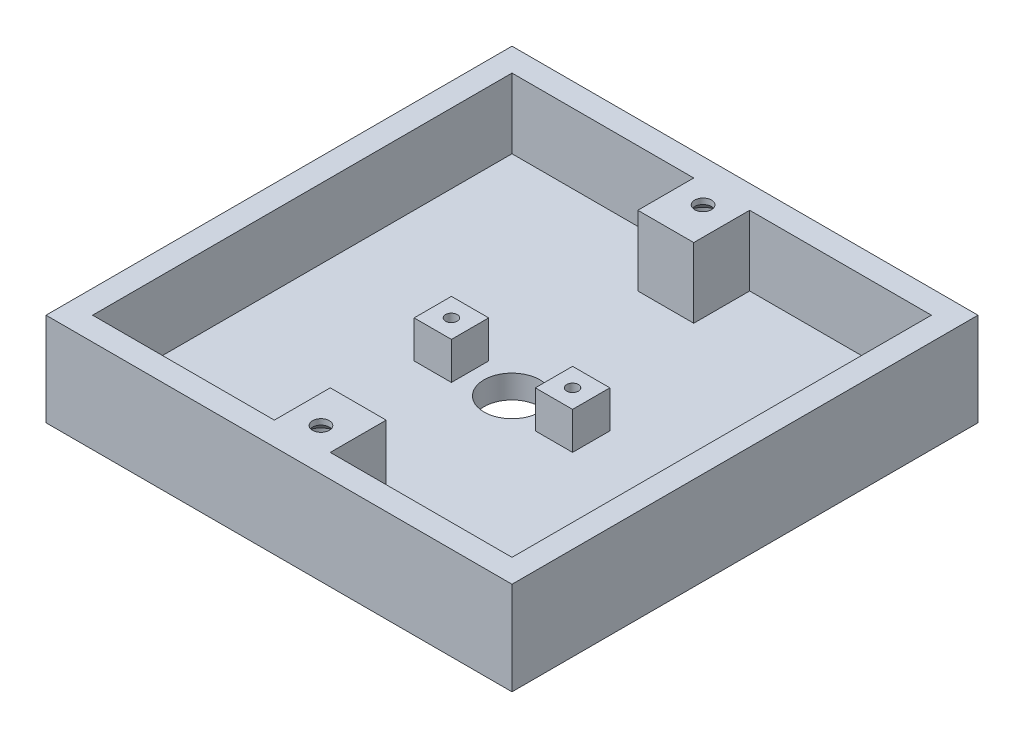
ISO-10303-21;
HEADER;
FILE_DESCRIPTION(('STEP AP214'),'2;1');
FILE_NAME('part.step','',(''),(''),'','','');
FILE_SCHEMA(('AUTOMOTIVE_DESIGN { 1 0 10303 214 1 1 1 1 }'));
ENDSEC;
DATA;
#1=APPLICATION_CONTEXT('core data for automotive mechanical design processes');
#2=APPLICATION_PROTOCOL_DEFINITION('international standard','automotive_design',2000,#1);
#3=PRODUCT_CONTEXT('',#1,'mechanical');
#4=PRODUCT('Part','Part','',(#3));
#5=PRODUCT_RELATED_PRODUCT_CATEGORY('part','',(#4));
#6=PRODUCT_DEFINITION_FORMATION('','',#4);
#7=PRODUCT_DEFINITION_CONTEXT('part definition',#1,'design');
#8=PRODUCT_DEFINITION('design','',#6,#7);
#9=PRODUCT_DEFINITION_SHAPE('','',#8);
#10=(LENGTH_UNIT() NAMED_UNIT(*) SI_UNIT(.MILLI.,.METRE.));
#11=(NAMED_UNIT(*) PLANE_ANGLE_UNIT() SI_UNIT($,.RADIAN.));
#12=(NAMED_UNIT(*) SI_UNIT($,.STERADIAN.) SOLID_ANGLE_UNIT());
#13=UNCERTAINTY_MEASURE_WITH_UNIT(LENGTH_MEASURE(1.E-05),#10,'distance_accuracy_value','');
#14=(GEOMETRIC_REPRESENTATION_CONTEXT(3) GLOBAL_UNCERTAINTY_ASSIGNED_CONTEXT((#13)) GLOBAL_UNIT_ASSIGNED_CONTEXT((#10,
#11,#12)) REPRESENTATION_CONTEXT('',''));
#15=CARTESIAN_POINT('',(0.,0.,0.));
#16=DIRECTION('',(0.,0.,1.));
#17=DIRECTION('',(1.,0.,0.));
#18=AXIS2_PLACEMENT_3D('',#15,#16,#17);
#19=CARTESIAN_POINT('',(0.,2.5,0.));
#20=DIRECTION('',(0.,-1.,0.));
#21=DIRECTION('',(0.,0.,-1.));
#22=AXIS2_PLACEMENT_3D('',#19,#20,#21);
#23=PLANE('',#22);
#24=DIRECTION('',(0.,0.,1.));
#25=VECTOR('',#24,1.);
#26=CARTESIAN_POINT('',(-8.50000000000001,2.5,2.));
#27=LINE('',#26,#25);
#28=CARTESIAN_POINT('',(-8.50000000000001,2.5,-2.));
#29=VERTEX_POINT('',#28);
#30=CARTESIAN_POINT('',(-8.50000000000001,2.5,2.));
#31=VERTEX_POINT('',#30);
#32=EDGE_CURVE('E206',#29,#31,#27,.T.);
#33=ORIENTED_EDGE('',*,*,#32,.F.);
#34=DIRECTION('',(-1.,0.,0.));
#35=VECTOR('',#34,1.);
#36=CARTESIAN_POINT('',(-4.50000000000001,2.5,-2.));
#37=LINE('',#36,#35);
#38=CARTESIAN_POINT('',(-4.50000000000001,2.5,-2.));
#39=VERTEX_POINT('',#38);
#40=EDGE_CURVE('E239',#39,#29,#37,.T.);
#41=ORIENTED_EDGE('',*,*,#40,.F.);
#42=DIRECTION('',(0.,0.,-1.));
#43=VECTOR('',#42,1.);
#44=CARTESIAN_POINT('',(-4.50000000000001,2.5,2.));
#45=LINE('',#44,#43);
#46=CARTESIAN_POINT('',(-4.50000000000001,2.5,2.));
#47=VERTEX_POINT('',#46);
#48=EDGE_CURVE('E251',#47,#39,#45,.T.);
#49=ORIENTED_EDGE('',*,*,#48,.F.);
#50=DIRECTION('',(1.,0.,0.));
#51=VECTOR('',#50,1.);
#52=CARTESIAN_POINT('',(-4.50000000000001,2.5,2.));
#53=LINE('',#52,#51);
#54=EDGE_CURVE('E248',#31,#47,#53,.T.);
#55=ORIENTED_EDGE('',*,*,#54,.F.);
#56=EDGE_LOOP('',(#33,#41,#49,#55));
#57=FACE_BOUND('',#56,.T.);
#58=CARTESIAN_POINT('',(0.,2.5,0.));
#59=DIRECTION('',(0.,-1.,0.));
#60=DIRECTION('',(0.,0.,-1.));
#61=AXIS2_PLACEMENT_3D('',#58,#59,#60);
#62=CIRCLE('',#61,3.);
#63=CARTESIAN_POINT('',(0.,2.5,-3.));
#64=VERTEX_POINT('',#63);
#65=EDGE_CURVE('E270',#64,#64,#62,.T.);
#66=ORIENTED_EDGE('',*,*,#65,.T.);
#67=EDGE_LOOP('',(#66));
#68=FACE_BOUND('',#67,.T.);
#69=DIRECTION('',(-1.,0.,0.));
#70=VECTOR('',#69,1.);
#71=CARTESIAN_POINT('',(0.,2.5,-22.5));
#72=LINE('',#71,#70);
#73=CARTESIAN_POINT('',(22.5,2.5,-22.5));
#74=VERTEX_POINT('',#73);
#75=CARTESIAN_POINT('',(3.00000000000001,2.5,-22.5));
#76=VERTEX_POINT('',#75);
#77=EDGE_CURVE('E374',#74,#76,#72,.T.);
#78=ORIENTED_EDGE('',*,*,#77,.T.);
#79=DIRECTION('',(0.,0.,1.));
#80=VECTOR('',#79,1.);
#81=CARTESIAN_POINT('',(3.00000000000001,2.5,-16.5));
#82=LINE('',#81,#80);
#83=CARTESIAN_POINT('',(3.00000000000001,2.5,-16.5));
#84=VERTEX_POINT('',#83);
#85=EDGE_CURVE('E285',#76,#84,#82,.T.);
#86=ORIENTED_EDGE('',*,*,#85,.T.);
#87=DIRECTION('',(-1.,0.,0.));
#88=VECTOR('',#87,1.);
#89=CARTESIAN_POINT('',(-3.,2.5,-16.5));
#90=LINE('',#89,#88);
#91=CARTESIAN_POINT('',(-3.,2.5,-16.5));
#92=VERTEX_POINT('',#91);
#93=EDGE_CURVE('E296',#84,#92,#90,.T.);
#94=ORIENTED_EDGE('',*,*,#93,.T.);
#95=DIRECTION('',(0.,0.,-1.));
#96=VECTOR('',#95,1.);
#97=CARTESIAN_POINT('',(-3.,2.5,-16.5));
#98=LINE('',#97,#96);
#99=CARTESIAN_POINT('',(-3.,2.5,-22.5));
#100=VERTEX_POINT('',#99);
#101=EDGE_CURVE('E294',#92,#100,#98,.T.);
#102=ORIENTED_EDGE('',*,*,#101,.T.);
#103=CARTESIAN_POINT('',(-22.5,2.5,-22.5));
#104=VERTEX_POINT('',#103);
#105=EDGE_CURVE('E371',#100,#104,#72,.T.);
#106=ORIENTED_EDGE('',*,*,#105,.T.);
#107=DIRECTION('',(0.,0.,1.));
#108=VECTOR('',#107,1.);
#109=CARTESIAN_POINT('',(-22.5,2.5,0.));
#110=LINE('',#109,#108);
#111=CARTESIAN_POINT('',(-22.5,2.5,22.5));
#112=VERTEX_POINT('',#111);
#113=EDGE_CURVE('E332',#104,#112,#110,.T.);
#114=ORIENTED_EDGE('',*,*,#113,.T.);
#115=DIRECTION('',(1.,0.,0.));
#116=VECTOR('',#115,1.);
#117=CARTESIAN_POINT('',(0.,2.5,22.5));
#118=LINE('',#117,#116);
#119=CARTESIAN_POINT('',(-3.,2.5,22.5));
#120=VERTEX_POINT('',#119);
#121=EDGE_CURVE('E364',#112,#120,#118,.T.);
#122=ORIENTED_EDGE('',*,*,#121,.T.);
#123=DIRECTION('',(0.,0.,1.));
#124=VECTOR('',#123,1.);
#125=CARTESIAN_POINT('',(-3.,2.5,16.5));
#126=LINE('',#125,#124);
#127=CARTESIAN_POINT('',(-3.,2.5,16.5));
#128=VERTEX_POINT('',#127);
#129=EDGE_CURVE('E338',#128,#120,#126,.T.);
#130=ORIENTED_EDGE('',*,*,#129,.F.);
#131=DIRECTION('',(-1.,0.,0.));
#132=VECTOR('',#131,1.);
#133=CARTESIAN_POINT('',(-3.,2.5,16.5));
#134=LINE('',#133,#132);
#135=CARTESIAN_POINT('',(3.00000000000001,2.5,16.5));
#136=VERTEX_POINT('',#135);
#137=EDGE_CURVE('E335',#136,#128,#134,.T.);
#138=ORIENTED_EDGE('',*,*,#137,.F.);
#139=DIRECTION('',(0.,0.,-1.));
#140=VECTOR('',#139,1.);
#141=CARTESIAN_POINT('',(3.00000000000001,2.5,16.5));
#142=LINE('',#141,#140);
#143=CARTESIAN_POINT('',(3.00000000000001,2.5,22.5));
#144=VERTEX_POINT('',#143);
#145=EDGE_CURVE('E321',#144,#136,#142,.T.);
#146=ORIENTED_EDGE('',*,*,#145,.F.);
#147=CARTESIAN_POINT('',(22.5,2.5,22.5));
#148=VERTEX_POINT('',#147);
#149=EDGE_CURVE('E353',#144,#148,#118,.T.);
#150=ORIENTED_EDGE('',*,*,#149,.T.);
#151=DIRECTION('',(0.,0.,-1.));
#152=VECTOR('',#151,1.);
#153=CARTESIAN_POINT('',(22.5,2.5,0.));
#154=LINE('',#153,#152);
#155=EDGE_CURVE('E367',#148,#74,#154,.T.);
#156=ORIENTED_EDGE('',*,*,#155,.T.);
#157=EDGE_LOOP('',(#78,#86,#94,#102,#106,#114,#122,#130,#138,#146,#150,#156));
#158=FACE_BOUND('',#157,.T.);
#159=DIRECTION('',(0.,0.,-1.));
#160=VECTOR('',#159,1.);
#161=CARTESIAN_POINT('',(8.5,2.5,2.));
#162=LINE('',#161,#160);
#163=CARTESIAN_POINT('',(8.5,2.5,2.));
#164=VERTEX_POINT('',#163);
#165=CARTESIAN_POINT('',(8.5,2.5,-2.));
#166=VERTEX_POINT('',#165);
#167=EDGE_CURVE('E200',#164,#166,#162,.T.);
#168=ORIENTED_EDGE('',*,*,#167,.F.);
#169=DIRECTION('',(1.,0.,0.));
#170=VECTOR('',#169,1.);
#171=CARTESIAN_POINT('',(4.5,2.5,2.));
#172=LINE('',#171,#170);
#173=CARTESIAN_POINT('',(4.5,2.5,2.));
#174=VERTEX_POINT('',#173);
#175=EDGE_CURVE('E202',#174,#164,#172,.T.);
#176=ORIENTED_EDGE('',*,*,#175,.F.);
#177=DIRECTION('',(0.,0.,1.));
#178=VECTOR('',#177,1.);
#179=CARTESIAN_POINT('',(4.5,2.5,2.));
#180=LINE('',#179,#178);
#181=CARTESIAN_POINT('',(4.5,2.5,-2.));
#182=VERTEX_POINT('',#181);
#183=EDGE_CURVE('E63',#182,#174,#180,.T.);
#184=ORIENTED_EDGE('',*,*,#183,.F.);
#185=DIRECTION('',(-1.,0.,0.));
#186=VECTOR('',#185,1.);
#187=CARTESIAN_POINT('',(4.5,2.5,-2.));
#188=LINE('',#187,#186);
#189=EDGE_CURVE('E58',#166,#182,#188,.T.);
#190=ORIENTED_EDGE('',*,*,#189,.F.);
#191=EDGE_LOOP('',(#168,#176,#184,#190));
#192=FACE_BOUND('',#191,.T.);
#193=ADVANCED_FACE('F43',(#57,#68,#158,#192),#23,.F.);
#194=CARTESIAN_POINT('',(25.,10.,-22.5));
#195=DIRECTION('',(0.,0.,1.));
#196=DIRECTION('',(1.,0.,0.));
#197=AXIS2_PLACEMENT_3D('',#194,#195,#196);
#198=PLANE('',#197);
#199=DIRECTION('',(0.,-1.,0.));
#200=VECTOR('',#199,1.);
#201=CARTESIAN_POINT('',(3.00000000000001,18.4852813742386,-22.5));
#202=LINE('',#201,#200);
#203=CARTESIAN_POINT('',(3.00000000000001,10.,-22.5));
#204=VERTEX_POINT('',#203);
#205=EDGE_CURVE('E289',#204,#76,#202,.T.);
#206=ORIENTED_EDGE('',*,*,#205,.T.);
#207=ORIENTED_EDGE('',*,*,#77,.F.);
#208=DIRECTION('',(0.,-1.,0.));
#209=VECTOR('',#208,1.);
#210=CARTESIAN_POINT('',(22.5,10.,-22.5));
#211=LINE('',#210,#209);
#212=CARTESIAN_POINT('',(22.5,10.,-22.5));
#213=VERTEX_POINT('',#212);
#214=EDGE_CURVE('E362',#213,#74,#211,.T.);
#215=ORIENTED_EDGE('',*,*,#214,.F.);
#216=DIRECTION('',(-1.,0.,0.));
#217=VECTOR('',#216,1.);
#218=CARTESIAN_POINT('',(0.,10.,-22.5));
#219=LINE('',#218,#217);
#220=EDGE_CURVE('E363',#213,#204,#219,.T.);
#221=ORIENTED_EDGE('',*,*,#220,.T.);
#222=EDGE_LOOP('',(#206,#207,#215,#221));
#223=FACE_BOUND('',#222,.T.);
#224=ADVANCED_FACE('F439',(#223),#198,.T.);
#225=CARTESIAN_POINT('',(25.,10.,22.5));
#226=DIRECTION('',(0.,0.,-1.));
#227=DIRECTION('',(-1.,0.,0.));
#228=AXIS2_PLACEMENT_3D('',#225,#226,#227);
#229=PLANE('',#228);
#230=DIRECTION('',(1.,0.,0.));
#231=VECTOR('',#230,1.);
#232=CARTESIAN_POINT('',(0.,10.,22.5));
#233=LINE('',#232,#231);
#234=CARTESIAN_POINT('',(-22.5,10.,22.5));
#235=VERTEX_POINT('',#234);
#236=CARTESIAN_POINT('',(-3.,10.,22.5));
#237=VERTEX_POINT('',#236);
#238=EDGE_CURVE('E380',#235,#237,#233,.T.);
#239=ORIENTED_EDGE('',*,*,#238,.T.);
#240=DIRECTION('',(0.,-1.,0.));
#241=VECTOR('',#240,1.);
#242=CARTESIAN_POINT('',(-3.,18.4852813742386,22.5));
#243=LINE('',#242,#241);
#244=EDGE_CURVE('E344',#237,#120,#243,.T.);
#245=ORIENTED_EDGE('',*,*,#244,.T.);
#246=ORIENTED_EDGE('',*,*,#121,.F.);
#247=DIRECTION('',(0.,-1.,0.));
#248=VECTOR('',#247,1.);
#249=CARTESIAN_POINT('',(-22.5,10.,22.5));
#250=LINE('',#249,#248);
#251=EDGE_CURVE('E354',#235,#112,#250,.T.);
#252=ORIENTED_EDGE('',*,*,#251,.F.);
#253=EDGE_LOOP('',(#239,#245,#246,#252));
#254=FACE_BOUND('',#253,.T.);
#255=ADVANCED_FACE('F447',(#254),#229,.T.);
#256=ORIENTED_EDGE('',*,*,#149,.F.);
#257=DIRECTION('',(0.,-1.,0.));
#258=VECTOR('',#257,1.);
#259=CARTESIAN_POINT('',(3.00000000000001,18.4852813742386,22.5));
#260=LINE('',#259,#258);
#261=CARTESIAN_POINT('',(3.00000000000001,10.,22.5));
#262=VERTEX_POINT('',#261);
#263=EDGE_CURVE('E341',#262,#144,#260,.T.);
#264=ORIENTED_EDGE('',*,*,#263,.F.);
#265=CARTESIAN_POINT('',(22.5,10.,22.5));
#266=VERTEX_POINT('',#265);
#267=EDGE_CURVE('E379',#262,#266,#233,.T.);
#268=ORIENTED_EDGE('',*,*,#267,.T.);
#269=DIRECTION('',(0.,-1.,0.));
#270=VECTOR('',#269,1.);
#271=CARTESIAN_POINT('',(22.5,10.,22.5));
#272=LINE('',#271,#270);
#273=EDGE_CURVE('E358',#266,#148,#272,.T.);
#274=ORIENTED_EDGE('',*,*,#273,.T.);
#275=EDGE_LOOP('',(#256,#264,#268,#274));
#276=FACE_BOUND('',#275,.T.);
#277=ADVANCED_FACE('F456',(#276),#229,.T.);
#278=CARTESIAN_POINT('',(0.,10.,0.));
#279=DIRECTION('',(0.,-1.,0.));
#280=DIRECTION('',(0.,0.,-1.));
#281=AXIS2_PLACEMENT_3D('',#278,#279,#280);
#282=PLANE('',#281);
#283=CARTESIAN_POINT('',(0.,10.,-20.5));
#284=DIRECTION('',(0.,-1.,0.));
#285=DIRECTION('',(0.,0.,-1.));
#286=AXIS2_PLACEMENT_3D('',#283,#284,#285);
#287=CIRCLE('',#286,0.899999999999998);
#288=CARTESIAN_POINT('',(0.,10.,-21.4));
#289=VERTEX_POINT('',#288);
#290=EDGE_CURVE('E282',#289,#289,#287,.T.);
#291=ORIENTED_EDGE('',*,*,#290,.T.);
#292=EDGE_LOOP('',(#291));
#293=FACE_BOUND('',#292,.T.);
#294=CARTESIAN_POINT('',(0.,10.,20.5));
#295=DIRECTION('',(0.,-1.,0.));
#296=DIRECTION('',(0.,0.,-1.));
#297=AXIS2_PLACEMENT_3D('',#294,#295,#296);
#298=CIRCLE('',#297,0.899999999999998);
#299=CARTESIAN_POINT('',(0.,10.,19.6));
#300=VERTEX_POINT('',#299);
#301=EDGE_CURVE('E318',#300,#300,#298,.T.);
#302=ORIENTED_EDGE('',*,*,#301,.T.);
#303=EDGE_LOOP('',(#302));
#304=FACE_BOUND('',#303,.T.);
#305=DIRECTION('',(0.,0.,1.));
#306=VECTOR('',#305,1.);
#307=CARTESIAN_POINT('',(-25.,10.,-25.));
#308=LINE('',#307,#306);
#309=CARTESIAN_POINT('',(-25.,10.,-25.));
#310=VERTEX_POINT('',#309);
#311=CARTESIAN_POINT('',(-25.,10.,25.));
#312=VERTEX_POINT('',#311);
#313=EDGE_CURVE('E387',#310,#312,#308,.T.);
#314=ORIENTED_EDGE('',*,*,#313,.T.);
#315=DIRECTION('',(1.,0.,0.));
#316=VECTOR('',#315,1.);
#317=CARTESIAN_POINT('',(25.,10.,25.));
#318=LINE('',#317,#316);
#319=CARTESIAN_POINT('',(25.,10.,25.));
#320=VERTEX_POINT('',#319);
#321=EDGE_CURVE('E390',#312,#320,#318,.T.);
#322=ORIENTED_EDGE('',*,*,#321,.T.);
#323=DIRECTION('',(0.,0.,-1.));
#324=VECTOR('',#323,1.);
#325=CARTESIAN_POINT('',(25.,10.,-25.));
#326=LINE('',#325,#324);
#327=CARTESIAN_POINT('',(25.,10.,-25.));
#328=VERTEX_POINT('',#327);
#329=EDGE_CURVE('E393',#320,#328,#326,.T.);
#330=ORIENTED_EDGE('',*,*,#329,.T.);
#331=DIRECTION('',(-1.,0.,0.));
#332=VECTOR('',#331,1.);
#333=CARTESIAN_POINT('',(25.,10.,-25.));
#334=LINE('',#333,#332);
#335=EDGE_CURVE('E395',#328,#310,#334,.T.);
#336=ORIENTED_EDGE('',*,*,#335,.T.);
#337=EDGE_LOOP('',(#314,#322,#330,#336));
#338=FACE_BOUND('',#337,.T.);
#339=DIRECTION('',(0.,0.,1.));
#340=VECTOR('',#339,1.);
#341=CARTESIAN_POINT('',(-22.5,10.,0.));
#342=LINE('',#341,#340);
#343=CARTESIAN_POINT('',(-22.5,10.,-22.5));
#344=VERTEX_POINT('',#343);
#345=EDGE_CURVE('E377',#344,#235,#342,.T.);
#346=ORIENTED_EDGE('',*,*,#345,.F.);
#347=CARTESIAN_POINT('',(-3.,10.,-22.5));
#348=VERTEX_POINT('',#347);
#349=EDGE_CURVE('E385',#348,#344,#219,.T.);
#350=ORIENTED_EDGE('',*,*,#349,.F.);
#351=DIRECTION('',(0.,0.,1.));
#352=VECTOR('',#351,1.);
#353=CARTESIAN_POINT('',(-3.,10.,-16.5));
#354=LINE('',#353,#352);
#355=CARTESIAN_POINT('',(-3.,10.,-16.5));
#356=VERTEX_POINT('',#355);
#357=EDGE_CURVE('E286',#348,#356,#354,.T.);
#358=ORIENTED_EDGE('',*,*,#357,.T.);
#359=DIRECTION('',(1.,0.,0.));
#360=VECTOR('',#359,1.);
#361=CARTESIAN_POINT('',(-3.,10.,-16.5));
#362=LINE('',#361,#360);
#363=CARTESIAN_POINT('',(3.00000000000001,10.,-16.5));
#364=VERTEX_POINT('',#363);
#365=EDGE_CURVE('E292',#356,#364,#362,.T.);
#366=ORIENTED_EDGE('',*,*,#365,.T.);
#367=DIRECTION('',(0.,0.,-1.));
#368=VECTOR('',#367,1.);
#369=CARTESIAN_POINT('',(3.00000000000001,10.,-16.5));
#370=LINE('',#369,#368);
#371=EDGE_CURVE('E288',#364,#204,#370,.T.);
#372=ORIENTED_EDGE('',*,*,#371,.T.);
#373=ORIENTED_EDGE('',*,*,#220,.F.);
#374=DIRECTION('',(0.,0.,-1.));
#375=VECTOR('',#374,1.);
#376=CARTESIAN_POINT('',(22.5,10.,0.));
#377=LINE('',#376,#375);
#378=EDGE_CURVE('E382',#266,#213,#377,.T.);
#379=ORIENTED_EDGE('',*,*,#378,.F.);
#380=ORIENTED_EDGE('',*,*,#267,.F.);
#381=DIRECTION('',(0.,0.,1.));
#382=VECTOR('',#381,1.);
#383=CARTESIAN_POINT('',(3.00000000000001,10.,16.5));
#384=LINE('',#383,#382);
#385=CARTESIAN_POINT('',(3.00000000000001,10.,16.5));
#386=VERTEX_POINT('',#385);
#387=EDGE_CURVE('E329',#386,#262,#384,.T.);
#388=ORIENTED_EDGE('',*,*,#387,.F.);
#389=DIRECTION('',(1.,0.,0.));
#390=VECTOR('',#389,1.);
#391=CARTESIAN_POINT('',(-3.,10.,16.5));
#392=LINE('',#391,#390);
#393=CARTESIAN_POINT('',(-3.,10.,16.5));
#394=VERTEX_POINT('',#393);
#395=EDGE_CURVE('E325',#394,#386,#392,.T.);
#396=ORIENTED_EDGE('',*,*,#395,.F.);
#397=DIRECTION('',(0.,0.,-1.));
#398=VECTOR('',#397,1.);
#399=CARTESIAN_POINT('',(-3.,10.,16.5));
#400=LINE('',#399,#398);
#401=EDGE_CURVE('E322',#237,#394,#400,.T.);
#402=ORIENTED_EDGE('',*,*,#401,.F.);
#403=ORIENTED_EDGE('',*,*,#238,.F.);
#404=EDGE_LOOP('',(#346,#350,#358,#366,#372,#373,#379,#380,#388,#396,#402,#403));
#405=FACE_BOUND('',#404,.T.);
#406=ADVANCED_FACE('F429',(#293,#304,#338,#405),#282,.F.);
#407=CARTESIAN_POINT('',(-25.,10.,-25.));
#408=DIRECTION('',(1.,0.,0.));
#409=DIRECTION('',(0.,0.,-1.));
#410=AXIS2_PLACEMENT_3D('',#407,#408,#409);
#411=PLANE('',#410);
#412=DIRECTION('',(0.,0.,1.));
#413=VECTOR('',#412,1.);
#414=CARTESIAN_POINT('',(-25.,0.,-25.));
#415=LINE('',#414,#413);
#416=CARTESIAN_POINT('',(-25.,0.,-25.));
#417=VERTEX_POINT('',#416);
#418=CARTESIAN_POINT('',(-25.,0.,25.));
#419=VERTEX_POINT('',#418);
#420=EDGE_CURVE('E357',#417,#419,#415,.T.);
#421=ORIENTED_EDGE('',*,*,#420,.T.);
#422=DIRECTION('',(0.,-1.,0.));
#423=VECTOR('',#422,1.);
#424=CARTESIAN_POINT('',(-25.,10.,25.));
#425=LINE('',#424,#423);
#426=EDGE_CURVE('E11',#312,#419,#425,.T.);
#427=ORIENTED_EDGE('',*,*,#426,.F.);
#428=ORIENTED_EDGE('',*,*,#313,.F.);
#429=DIRECTION('',(0.,-1.,0.));
#430=VECTOR('',#429,1.);
#431=CARTESIAN_POINT('',(-25.,10.,-25.));
#432=LINE('',#431,#430);
#433=EDGE_CURVE('E397',#310,#417,#432,.T.);
#434=ORIENTED_EDGE('',*,*,#433,.T.);
#435=EDGE_LOOP('',(#421,#427,#428,#434));
#436=FACE_BOUND('',#435,.T.);
#437=ADVANCED_FACE('F45',(#436),#411,.F.);
#438=CARTESIAN_POINT('',(25.,10.,25.));
#439=DIRECTION('',(0.,0.,-1.));
#440=DIRECTION('',(-1.,0.,0.));
#441=AXIS2_PLACEMENT_3D('',#438,#439,#440);
#442=PLANE('',#441);
#443=DIRECTION('',(1.,0.,0.));
#444=VECTOR('',#443,1.);
#445=CARTESIAN_POINT('',(25.,0.,25.));
#446=LINE('',#445,#444);
#447=CARTESIAN_POINT('',(25.,0.,25.));
#448=VERTEX_POINT('',#447);
#449=EDGE_CURVE('E400',#419,#448,#446,.T.);
#450=ORIENTED_EDGE('',*,*,#449,.T.);
#451=DIRECTION('',(0.,-1.,0.));
#452=VECTOR('',#451,1.);
#453=CARTESIAN_POINT('',(25.,10.,25.));
#454=LINE('',#453,#452);
#455=EDGE_CURVE('E51',#320,#448,#454,.T.);
#456=ORIENTED_EDGE('',*,*,#455,.F.);
#457=ORIENTED_EDGE('',*,*,#321,.F.);
#458=ORIENTED_EDGE('',*,*,#426,.T.);
#459=EDGE_LOOP('',(#450,#456,#457,#458));
#460=FACE_BOUND('',#459,.T.);
#461=ADVANCED_FACE('F431',(#460),#442,.F.);
#462=CARTESIAN_POINT('',(25.,10.,-25.));
#463=DIRECTION('',(-1.,0.,0.));
#464=DIRECTION('',(0.,0.,1.));
#465=AXIS2_PLACEMENT_3D('',#462,#463,#464);
#466=PLANE('',#465);
#467=DIRECTION('',(0.,0.,-1.));
#468=VECTOR('',#467,1.);
#469=CARTESIAN_POINT('',(25.,0.,-25.));
#470=LINE('',#469,#468);
#471=CARTESIAN_POINT('',(25.,0.,-25.));
#472=VERTEX_POINT('',#471);
#473=EDGE_CURVE('E402',#448,#472,#470,.T.);
#474=ORIENTED_EDGE('',*,*,#473,.T.);
#475=DIRECTION('',(0.,-1.,0.));
#476=VECTOR('',#475,1.);
#477=CARTESIAN_POINT('',(25.,10.,-25.));
#478=LINE('',#477,#476);
#479=EDGE_CURVE('E407',#328,#472,#478,.T.);
#480=ORIENTED_EDGE('',*,*,#479,.F.);
#481=ORIENTED_EDGE('',*,*,#329,.F.);
#482=ORIENTED_EDGE('',*,*,#455,.T.);
#483=EDGE_LOOP('',(#474,#480,#481,#482));
#484=FACE_BOUND('',#483,.T.);
#485=ADVANCED_FACE('F414',(#484),#466,.F.);
#486=CARTESIAN_POINT('',(25.,10.,-25.));
#487=DIRECTION('',(0.,0.,1.));
#488=DIRECTION('',(1.,0.,0.));
#489=AXIS2_PLACEMENT_3D('',#486,#487,#488);
#490=PLANE('',#489);
#491=DIRECTION('',(-1.,0.,0.));
#492=VECTOR('',#491,1.);
#493=CARTESIAN_POINT('',(25.,0.,-25.));
#494=LINE('',#493,#492);
#495=EDGE_CURVE('E391',#472,#417,#494,.T.);
#496=ORIENTED_EDGE('',*,*,#495,.T.);
#497=ORIENTED_EDGE('',*,*,#433,.F.);
#498=ORIENTED_EDGE('',*,*,#335,.F.);
#499=ORIENTED_EDGE('',*,*,#479,.T.);
#500=EDGE_LOOP('',(#496,#497,#498,#499));
#501=FACE_BOUND('',#500,.T.);
#502=ADVANCED_FACE('F423',(#501),#490,.F.);
#503=CARTESIAN_POINT('',(0.,0.,0.));
#504=DIRECTION('',(0.,-1.,0.));
#505=DIRECTION('',(0.,0.,-1.));
#506=AXIS2_PLACEMENT_3D('',#503,#504,#505);
#507=PLANE('',#506);
#508=CARTESIAN_POINT('',(6.5,0.,0.));
#509=DIRECTION('',(0.,-1.,0.));
#510=DIRECTION('',(0.,0.,-1.));
#511=AXIS2_PLACEMENT_3D('',#508,#509,#510);
#512=CIRCLE('',#511,0.624999999999988);
#513=CARTESIAN_POINT('',(6.5,0.,-0.624999999999988));
#514=VERTEX_POINT('',#513);
#515=EDGE_CURVE('E891',#514,#514,#512,.T.);
#516=ORIENTED_EDGE('',*,*,#515,.F.);
#517=EDGE_LOOP('',(#516));
#518=FACE_BOUND('',#517,.T.);
#519=CARTESIAN_POINT('',(-6.50000000000001,0.,0.));
#520=DIRECTION('',(0.,-1.,0.));
#521=DIRECTION('',(0.,0.,-1.));
#522=AXIS2_PLACEMENT_3D('',#519,#520,#521);
#523=CIRCLE('',#522,0.624999999999988);
#524=CARTESIAN_POINT('',(-6.50000000000001,0.,-0.624999999999988));
#525=VERTEX_POINT('',#524);
#526=EDGE_CURVE('E895',#525,#525,#523,.T.);
#527=ORIENTED_EDGE('',*,*,#526,.F.);
#528=EDGE_LOOP('',(#527));
#529=FACE_BOUND('',#528,.T.);
#530=CARTESIAN_POINT('',(0.,0.,0.));
#531=DIRECTION('',(0.,-1.,0.));
#532=DIRECTION('',(0.,0.,-1.));
#533=AXIS2_PLACEMENT_3D('',#530,#531,#532);
#534=CIRCLE('',#533,3.);
#535=CARTESIAN_POINT('',(0.,0.,-3.));
#536=VERTEX_POINT('',#535);
#537=EDGE_CURVE('E267',#536,#536,#534,.T.);
#538=ORIENTED_EDGE('',*,*,#537,.F.);
#539=EDGE_LOOP('',(#538));
#540=FACE_BOUND('',#539,.T.);
#541=CARTESIAN_POINT('',(0.,0.,-20.5));
#542=DIRECTION('',(0.,-1.,0.));
#543=DIRECTION('',(0.,0.,-1.));
#544=AXIS2_PLACEMENT_3D('',#541,#542,#543);
#545=CIRCLE('',#544,1.8);
#546=CARTESIAN_POINT('',(0.,0.,-22.3));
#547=VERTEX_POINT('',#546);
#548=EDGE_CURVE('E273',#547,#547,#545,.T.);
#549=ORIENTED_EDGE('',*,*,#548,.F.);
#550=EDGE_LOOP('',(#549));
#551=FACE_BOUND('',#550,.T.);
#552=CARTESIAN_POINT('',(0.,0.,20.5));
#553=DIRECTION('',(0.,-1.,0.));
#554=DIRECTION('',(0.,0.,-1.));
#555=AXIS2_PLACEMENT_3D('',#552,#553,#554);
#556=CIRCLE('',#555,1.8);
#557=CARTESIAN_POINT('',(0.,0.,18.7));
#558=VERTEX_POINT('',#557);
#559=EDGE_CURVE('E309',#558,#558,#556,.T.);
#560=ORIENTED_EDGE('',*,*,#559,.F.);
#561=EDGE_LOOP('',(#560));
#562=FACE_BOUND('',#561,.T.);
#563=ORIENTED_EDGE('',*,*,#420,.F.);
#564=ORIENTED_EDGE('',*,*,#495,.F.);
#565=ORIENTED_EDGE('',*,*,#473,.F.);
#566=ORIENTED_EDGE('',*,*,#449,.F.);
#567=EDGE_LOOP('',(#563,#564,#565,#566));
#568=FACE_BOUND('',#567,.T.);
#569=ADVANCED_FACE('F420',(#518,#529,#540,#551,#562,#568),#507,.T.);
#570=CARTESIAN_POINT('',(-22.5,10.,-25.));
#571=DIRECTION('',(1.,0.,0.));
#572=DIRECTION('',(0.,0.,-1.));
#573=AXIS2_PLACEMENT_3D('',#570,#571,#572);
#574=PLANE('',#573);
#575=ORIENTED_EDGE('',*,*,#113,.F.);
#576=DIRECTION('',(0.,-1.,0.));
#577=VECTOR('',#576,1.);
#578=CARTESIAN_POINT('',(-22.5,10.,-22.5));
#579=LINE('',#578,#577);
#580=EDGE_CURVE('E359',#344,#104,#579,.T.);
#581=ORIENTED_EDGE('',*,*,#580,.F.);
#582=ORIENTED_EDGE('',*,*,#345,.T.);
#583=ORIENTED_EDGE('',*,*,#251,.T.);
#584=EDGE_LOOP('',(#575,#581,#582,#583));
#585=FACE_BOUND('',#584,.T.);
#586=ADVANCED_FACE('F460',(#585),#574,.T.);
#587=CARTESIAN_POINT('',(22.5,10.,-25.));
#588=DIRECTION('',(-1.,0.,0.));
#589=DIRECTION('',(0.,0.,1.));
#590=AXIS2_PLACEMENT_3D('',#587,#588,#589);
#591=PLANE('',#590);
#592=ORIENTED_EDGE('',*,*,#155,.F.);
#593=ORIENTED_EDGE('',*,*,#273,.F.);
#594=ORIENTED_EDGE('',*,*,#378,.T.);
#595=ORIENTED_EDGE('',*,*,#214,.T.);
#596=EDGE_LOOP('',(#592,#593,#594,#595));
#597=FACE_BOUND('',#596,.T.);
#598=ADVANCED_FACE('F485',(#597),#591,.T.);
#599=DIRECTION('',(0.,-1.,0.));
#600=VECTOR('',#599,1.);
#601=CARTESIAN_POINT('',(-3.,18.4852813742386,-22.5));
#602=LINE('',#601,#600);
#603=EDGE_CURVE('E304',#348,#100,#602,.T.);
#604=ORIENTED_EDGE('',*,*,#603,.F.);
#605=ORIENTED_EDGE('',*,*,#349,.T.);
#606=ORIENTED_EDGE('',*,*,#580,.T.);
#607=ORIENTED_EDGE('',*,*,#105,.F.);
#608=EDGE_LOOP('',(#604,#605,#606,#607));
#609=FACE_BOUND('',#608,.T.);
#610=ADVANCED_FACE('F450',(#609),#198,.T.);
#611=CARTESIAN_POINT('',(-3.,18.4852813742386,16.5));
#612=DIRECTION('',(1.,0.,0.));
#613=DIRECTION('',(0.,0.,-1.));
#614=AXIS2_PLACEMENT_3D('',#611,#612,#613);
#615=PLANE('',#614);
#616=ORIENTED_EDGE('',*,*,#244,.F.);
#617=ORIENTED_EDGE('',*,*,#401,.T.);
#618=DIRECTION('',(0.,-1.,0.));
#619=VECTOR('',#618,1.);
#620=CARTESIAN_POINT('',(-3.,18.4852813742386,16.5));
#621=LINE('',#620,#619);
#622=EDGE_CURVE('E346',#394,#128,#621,.T.);
#623=ORIENTED_EDGE('',*,*,#622,.T.);
#624=ORIENTED_EDGE('',*,*,#129,.T.);
#625=EDGE_LOOP('',(#616,#617,#623,#624));
#626=FACE_BOUND('',#625,.T.);
#627=ADVANCED_FACE('F501',(#626),#615,.F.);
#628=CARTESIAN_POINT('',(-3.,18.4852813742386,16.5));
#629=DIRECTION('',(0.,0.,1.));
#630=DIRECTION('',(1.,0.,0.));
#631=AXIS2_PLACEMENT_3D('',#628,#629,#630);
#632=PLANE('',#631);
#633=ORIENTED_EDGE('',*,*,#622,.F.);
#634=ORIENTED_EDGE('',*,*,#395,.T.);
#635=DIRECTION('',(0.,-1.,0.));
#636=VECTOR('',#635,1.);
#637=CARTESIAN_POINT('',(3.00000000000001,18.4852813742386,16.5));
#638=LINE('',#637,#636);
#639=EDGE_CURVE('E326',#386,#136,#638,.T.);
#640=ORIENTED_EDGE('',*,*,#639,.T.);
#641=ORIENTED_EDGE('',*,*,#137,.T.);
#642=EDGE_LOOP('',(#633,#634,#640,#641));
#643=FACE_BOUND('',#642,.T.);
#644=ADVANCED_FACE('F546',(#643),#632,.F.);
#645=CARTESIAN_POINT('',(3.00000000000001,18.4852813742386,16.5));
#646=DIRECTION('',(-1.,0.,0.));
#647=DIRECTION('',(0.,0.,1.));
#648=AXIS2_PLACEMENT_3D('',#645,#646,#647);
#649=PLANE('',#648);
#650=ORIENTED_EDGE('',*,*,#639,.F.);
#651=ORIENTED_EDGE('',*,*,#387,.T.);
#652=ORIENTED_EDGE('',*,*,#263,.T.);
#653=ORIENTED_EDGE('',*,*,#145,.T.);
#654=EDGE_LOOP('',(#650,#651,#652,#653));
#655=FACE_BOUND('',#654,.T.);
#656=ADVANCED_FACE('F554',(#655),#649,.F.);
#657=CARTESIAN_POINT('',(0.,0.,20.5));
#658=DIRECTION('',(0.,-1.,0.));
#659=DIRECTION('',(0.,0.,-1.));
#660=AXIS2_PLACEMENT_3D('',#657,#658,#659);
#661=CYLINDRICAL_SURFACE('',#660,0.899999999999998);
#662=ORIENTED_EDGE('',*,*,#301,.F.);
#663=EDGE_LOOP('',(#662));
#664=FACE_BOUND('',#663,.T.);
#665=CARTESIAN_POINT('',(0.,9.4,20.5));
#666=DIRECTION('',(0.,-1.,0.));
#667=DIRECTION('',(0.,0.,-1.));
#668=AXIS2_PLACEMENT_3D('',#665,#666,#667);
#669=CIRCLE('',#668,0.899999999999998);
#670=CARTESIAN_POINT('',(0.,9.4,19.6));
#671=VERTEX_POINT('',#670);
#672=EDGE_CURVE('E315',#671,#671,#669,.T.);
#673=ORIENTED_EDGE('',*,*,#672,.T.);
#674=EDGE_LOOP('',(#673));
#675=FACE_BOUND('',#674,.T.);
#676=ADVANCED_FACE('F562',(#664,#675),#661,.F.);
#677=CARTESIAN_POINT('',(0.,8.5,20.5));
#678=DIRECTION('',(0.,-1.,0.));
#679=DIRECTION('',(0.,0.,-1.));
#680=AXIS2_PLACEMENT_3D('',#677,#678,#679);
#681=CONICAL_SURFACE('',#680,1.8,0.78539816339745);
#682=ORIENTED_EDGE('',*,*,#672,.F.);
#683=EDGE_LOOP('',(#682));
#684=FACE_BOUND('',#683,.T.);
#685=CARTESIAN_POINT('',(0.,8.5,20.5));
#686=DIRECTION('',(0.,-1.,0.));
#687=DIRECTION('',(0.,0.,-1.));
#688=AXIS2_PLACEMENT_3D('',#685,#686,#687);
#689=CIRCLE('',#688,1.8);
#690=CARTESIAN_POINT('',(0.,8.5,18.7));
#691=VERTEX_POINT('',#690);
#692=EDGE_CURVE('E312',#691,#691,#689,.T.);
#693=ORIENTED_EDGE('',*,*,#692,.T.);
#694=EDGE_LOOP('',(#693));
#695=FACE_BOUND('',#694,.T.);
#696=ADVANCED_FACE('F570',(#684,#695),#681,.F.);
#697=CARTESIAN_POINT('',(0.,0.,20.5));
#698=DIRECTION('',(0.,-1.,0.));
#699=DIRECTION('',(0.,0.,-1.));
#700=AXIS2_PLACEMENT_3D('',#697,#698,#699);
#701=CYLINDRICAL_SURFACE('',#700,1.8);
#702=ORIENTED_EDGE('',*,*,#692,.F.);
#703=EDGE_LOOP('',(#702));
#704=FACE_BOUND('',#703,.T.);
#705=ORIENTED_EDGE('',*,*,#559,.T.);
#706=EDGE_LOOP('',(#705));
#707=FACE_BOUND('',#706,.T.);
#708=ADVANCED_FACE('F578',(#704,#707),#701,.F.);
#709=CARTESIAN_POINT('',(3.00000000000001,18.4852813742386,-16.5));
#710=DIRECTION('',(1.,0.,0.));
#711=DIRECTION('',(0.,0.,-1.));
#712=AXIS2_PLACEMENT_3D('',#709,#710,#711);
#713=PLANE('',#712);
#714=ORIENTED_EDGE('',*,*,#371,.F.);
#715=DIRECTION('',(0.,-1.,0.));
#716=VECTOR('',#715,1.);
#717=CARTESIAN_POINT('',(3.00000000000001,18.4852813742386,-16.5));
#718=LINE('',#717,#716);
#719=EDGE_CURVE('E298',#364,#84,#718,.T.);
#720=ORIENTED_EDGE('',*,*,#719,.T.);
#721=ORIENTED_EDGE('',*,*,#85,.F.);
#722=ORIENTED_EDGE('',*,*,#205,.F.);
#723=EDGE_LOOP('',(#714,#720,#721,#722));
#724=FACE_BOUND('',#723,.T.);
#725=ADVANCED_FACE('F586',(#724),#713,.T.);
#726=CARTESIAN_POINT('',(-3.,18.4852813742386,-16.5));
#727=DIRECTION('',(-1.,0.,0.));
#728=DIRECTION('',(0.,0.,1.));
#729=AXIS2_PLACEMENT_3D('',#726,#727,#728);
#730=PLANE('',#729);
#731=ORIENTED_EDGE('',*,*,#357,.F.);
#732=ORIENTED_EDGE('',*,*,#603,.T.);
#733=ORIENTED_EDGE('',*,*,#101,.F.);
#734=DIRECTION('',(0.,-1.,0.));
#735=VECTOR('',#734,1.);
#736=CARTESIAN_POINT('',(-3.,18.4852813742386,-16.5));
#737=LINE('',#736,#735);
#738=EDGE_CURVE('E301',#356,#92,#737,.T.);
#739=ORIENTED_EDGE('',*,*,#738,.F.);
#740=EDGE_LOOP('',(#731,#732,#733,#739));
#741=FACE_BOUND('',#740,.T.);
#742=ADVANCED_FACE('F592',(#741),#730,.T.);
#743=CARTESIAN_POINT('',(-3.,18.4852813742386,-16.5));
#744=DIRECTION('',(0.,0.,1.));
#745=DIRECTION('',(1.,0.,0.));
#746=AXIS2_PLACEMENT_3D('',#743,#744,#745);
#747=PLANE('',#746);
#748=ORIENTED_EDGE('',*,*,#365,.F.);
#749=ORIENTED_EDGE('',*,*,#738,.T.);
#750=ORIENTED_EDGE('',*,*,#93,.F.);
#751=ORIENTED_EDGE('',*,*,#719,.F.);
#752=EDGE_LOOP('',(#748,#749,#750,#751));
#753=FACE_BOUND('',#752,.T.);
#754=ADVANCED_FACE('F600',(#753),#747,.T.);
#755=CARTESIAN_POINT('',(0.,0.,-20.5));
#756=DIRECTION('',(0.,-1.,0.));
#757=DIRECTION('',(0.,0.,-1.));
#758=AXIS2_PLACEMENT_3D('',#755,#756,#757);
#759=CYLINDRICAL_SURFACE('',#758,0.899999999999998);
#760=ORIENTED_EDGE('',*,*,#290,.F.);
#761=EDGE_LOOP('',(#760));
#762=FACE_BOUND('',#761,.T.);
#763=CARTESIAN_POINT('',(0.,9.4,-20.5));
#764=DIRECTION('',(0.,-1.,0.));
#765=DIRECTION('',(0.,0.,-1.));
#766=AXIS2_PLACEMENT_3D('',#763,#764,#765);
#767=CIRCLE('',#766,0.899999999999998);
#768=CARTESIAN_POINT('',(0.,9.4,-21.4));
#769=VERTEX_POINT('',#768);
#770=EDGE_CURVE('E279',#769,#769,#767,.T.);
#771=ORIENTED_EDGE('',*,*,#770,.T.);
#772=EDGE_LOOP('',(#771));
#773=FACE_BOUND('',#772,.T.);
#774=ADVANCED_FACE('F608',(#762,#773),#759,.F.);
#775=CARTESIAN_POINT('',(0.,8.5,-20.5));
#776=DIRECTION('',(0.,-1.,0.));
#777=DIRECTION('',(0.,0.,-1.));
#778=AXIS2_PLACEMENT_3D('',#775,#776,#777);
#779=CONICAL_SURFACE('',#778,1.8,0.78539816339745);
#780=ORIENTED_EDGE('',*,*,#770,.F.);
#781=EDGE_LOOP('',(#780));
#782=FACE_BOUND('',#781,.T.);
#783=CARTESIAN_POINT('',(0.,8.5,-20.5));
#784=DIRECTION('',(0.,-1.,0.));
#785=DIRECTION('',(0.,0.,-1.));
#786=AXIS2_PLACEMENT_3D('',#783,#784,#785);
#787=CIRCLE('',#786,1.8);
#788=CARTESIAN_POINT('',(0.,8.5,-22.3));
#789=VERTEX_POINT('',#788);
#790=EDGE_CURVE('E276',#789,#789,#787,.T.);
#791=ORIENTED_EDGE('',*,*,#790,.T.);
#792=EDGE_LOOP('',(#791));
#793=FACE_BOUND('',#792,.T.);
#794=ADVANCED_FACE('F616',(#782,#793),#779,.F.);
#795=CARTESIAN_POINT('',(0.,0.,-20.5));
#796=DIRECTION('',(0.,-1.,0.));
#797=DIRECTION('',(0.,0.,-1.));
#798=AXIS2_PLACEMENT_3D('',#795,#796,#797);
#799=CYLINDRICAL_SURFACE('',#798,1.8);
#800=ORIENTED_EDGE('',*,*,#790,.F.);
#801=EDGE_LOOP('',(#800));
#802=FACE_BOUND('',#801,.T.);
#803=ORIENTED_EDGE('',*,*,#548,.T.);
#804=EDGE_LOOP('',(#803));
#805=FACE_BOUND('',#804,.T.);
#806=ADVANCED_FACE('F624',(#802,#805),#799,.F.);
#807=CARTESIAN_POINT('',(0.,10.,0.));
#808=DIRECTION('',(0.,-1.,0.));
#809=DIRECTION('',(0.,0.,-1.));
#810=AXIS2_PLACEMENT_3D('',#807,#808,#809);
#811=CYLINDRICAL_SURFACE('',#810,3.);
#812=ORIENTED_EDGE('',*,*,#537,.T.);
#813=EDGE_LOOP('',(#812));
#814=FACE_BOUND('',#813,.T.);
#815=ORIENTED_EDGE('',*,*,#65,.F.);
#816=EDGE_LOOP('',(#815));
#817=FACE_BOUND('',#816,.T.);
#818=ADVANCED_FACE('F632',(#814,#817),#811,.F.);
#819=CARTESIAN_POINT('',(-8.50000000000001,6.5,2.));
#820=DIRECTION('',(1.,0.,0.));
#821=DIRECTION('',(0.,0.,-1.));
#822=AXIS2_PLACEMENT_3D('',#819,#820,#821);
#823=PLANE('',#822);
#824=ORIENTED_EDGE('',*,*,#32,.T.);
#825=DIRECTION('',(0.,-1.,0.));
#826=VECTOR('',#825,1.);
#827=CARTESIAN_POINT('',(-8.50000000000001,6.5,2.));
#828=LINE('',#827,#826);
#829=CARTESIAN_POINT('',(-8.50000000000001,6.5,2.));
#830=VERTEX_POINT('',#829);
#831=EDGE_CURVE('E264',#830,#31,#828,.T.);
#832=ORIENTED_EDGE('',*,*,#831,.F.);
#833=DIRECTION('',(0.,0.,1.));
#834=VECTOR('',#833,1.);
#835=CARTESIAN_POINT('',(-8.50000000000001,6.5,2.));
#836=LINE('',#835,#834);
#837=CARTESIAN_POINT('',(-8.50000000000001,6.5,-2.));
#838=VERTEX_POINT('',#837);
#839=EDGE_CURVE('E235',#838,#830,#836,.T.);
#840=ORIENTED_EDGE('',*,*,#839,.F.);
#841=DIRECTION('',(0.,-1.,0.));
#842=VECTOR('',#841,1.);
#843=CARTESIAN_POINT('',(-8.50000000000001,6.5,-2.));
#844=LINE('',#843,#842);
#845=EDGE_CURVE('E245',#838,#29,#844,.T.);
#846=ORIENTED_EDGE('',*,*,#845,.T.);
#847=EDGE_LOOP('',(#824,#832,#840,#846));
#848=FACE_BOUND('',#847,.T.);
#849=ADVANCED_FACE('F639',(#848),#823,.F.);
#850=CARTESIAN_POINT('',(-4.50000000000001,6.5,2.));
#851=DIRECTION('',(0.,0.,-1.));
#852=DIRECTION('',(-1.,0.,0.));
#853=AXIS2_PLACEMENT_3D('',#850,#851,#852);
#854=PLANE('',#853);
#855=ORIENTED_EDGE('',*,*,#54,.T.);
#856=DIRECTION('',(0.,-1.,0.));
#857=VECTOR('',#856,1.);
#858=CARTESIAN_POINT('',(-4.50000000000001,6.5,2.));
#859=LINE('',#858,#857);
#860=CARTESIAN_POINT('',(-4.50000000000001,6.5,2.));
#861=VERTEX_POINT('',#860);
#862=EDGE_CURVE('E261',#861,#47,#859,.T.);
#863=ORIENTED_EDGE('',*,*,#862,.F.);
#864=DIRECTION('',(1.,0.,0.));
#865=VECTOR('',#864,1.);
#866=CARTESIAN_POINT('',(-4.50000000000001,6.5,2.));
#867=LINE('',#866,#865);
#868=EDGE_CURVE('E238',#830,#861,#867,.T.);
#869=ORIENTED_EDGE('',*,*,#868,.F.);
#870=ORIENTED_EDGE('',*,*,#831,.T.);
#871=EDGE_LOOP('',(#855,#863,#869,#870));
#872=FACE_BOUND('',#871,.T.);
#873=ADVANCED_FACE('F645',(#872),#854,.F.);
#874=CARTESIAN_POINT('',(-4.50000000000001,6.5,2.));
#875=DIRECTION('',(-1.,0.,0.));
#876=DIRECTION('',(0.,0.,1.));
#877=AXIS2_PLACEMENT_3D('',#874,#875,#876);
#878=PLANE('',#877);
#879=ORIENTED_EDGE('',*,*,#48,.T.);
#880=DIRECTION('',(0.,-1.,0.));
#881=VECTOR('',#880,1.);
#882=CARTESIAN_POINT('',(-4.50000000000001,6.5,-2.));
#883=LINE('',#882,#881);
#884=CARTESIAN_POINT('',(-4.50000000000001,6.5,-2.));
#885=VERTEX_POINT('',#884);
#886=EDGE_CURVE('E258',#885,#39,#883,.T.);
#887=ORIENTED_EDGE('',*,*,#886,.F.);
#888=DIRECTION('',(0.,0.,-1.));
#889=VECTOR('',#888,1.);
#890=CARTESIAN_POINT('',(-4.50000000000001,6.5,2.));
#891=LINE('',#890,#889);
#892=EDGE_CURVE('E241',#861,#885,#891,.T.);
#893=ORIENTED_EDGE('',*,*,#892,.F.);
#894=ORIENTED_EDGE('',*,*,#862,.T.);
#895=EDGE_LOOP('',(#879,#887,#893,#894));
#896=FACE_BOUND('',#895,.T.);
#897=ADVANCED_FACE('F652',(#896),#878,.F.);
#898=CARTESIAN_POINT('',(-4.50000000000001,6.5,-2.));
#899=DIRECTION('',(0.,0.,1.));
#900=DIRECTION('',(1.,0.,0.));
#901=AXIS2_PLACEMENT_3D('',#898,#899,#900);
#902=PLANE('',#901);
#903=ORIENTED_EDGE('',*,*,#40,.T.);
#904=ORIENTED_EDGE('',*,*,#845,.F.);
#905=DIRECTION('',(-1.,0.,0.));
#906=VECTOR('',#905,1.);
#907=CARTESIAN_POINT('',(-4.50000000000001,6.5,-2.));
#908=LINE('',#907,#906);
#909=EDGE_CURVE('E243',#885,#838,#908,.T.);
#910=ORIENTED_EDGE('',*,*,#909,.F.);
#911=ORIENTED_EDGE('',*,*,#886,.T.);
#912=EDGE_LOOP('',(#903,#904,#910,#911));
#913=FACE_BOUND('',#912,.T.);
#914=ADVANCED_FACE('F660',(#913),#902,.F.);
#915=CARTESIAN_POINT('',(0.,6.5,0.));
#916=DIRECTION('',(0.,1.,0.));
#917=DIRECTION('',(0.,0.,1.));
#918=AXIS2_PLACEMENT_3D('',#915,#916,#917);
#919=PLANE('',#918);
#920=CARTESIAN_POINT('',(-6.50000000000001,6.5,0.));
#921=DIRECTION('',(0.,1.,0.));
#922=DIRECTION('',(0.,0.,1.));
#923=AXIS2_PLACEMENT_3D('',#920,#921,#922);
#924=CIRCLE('',#923,0.624999999999993);
#925=CARTESIAN_POINT('',(-6.50000000000001,6.5,0.624999999999993));
#926=VERTEX_POINT('',#925);
#927=EDGE_CURVE('E898',#926,#926,#924,.T.);
#928=ORIENTED_EDGE('',*,*,#927,.F.);
#929=EDGE_LOOP('',(#928));
#930=FACE_BOUND('',#929,.T.);
#931=ORIENTED_EDGE('',*,*,#839,.T.);
#932=ORIENTED_EDGE('',*,*,#868,.T.);
#933=ORIENTED_EDGE('',*,*,#892,.T.);
#934=ORIENTED_EDGE('',*,*,#909,.T.);
#935=EDGE_LOOP('',(#931,#932,#933,#934));
#936=FACE_BOUND('',#935,.T.);
#937=ADVANCED_FACE('F668',(#930,#936),#919,.T.);
#938=CARTESIAN_POINT('',(8.5,6.5,2.));
#939=DIRECTION('',(-1.,0.,0.));
#940=DIRECTION('',(0.,0.,1.));
#941=AXIS2_PLACEMENT_3D('',#938,#939,#940);
#942=PLANE('',#941);
#943=ORIENTED_EDGE('',*,*,#167,.T.);
#944=DIRECTION('',(0.,-1.,0.));
#945=VECTOR('',#944,1.);
#946=CARTESIAN_POINT('',(8.5,6.5,-2.));
#947=LINE('',#946,#945);
#948=CARTESIAN_POINT('',(8.5,6.5,-2.));
#949=VERTEX_POINT('',#948);
#950=EDGE_CURVE('E904',#949,#166,#947,.T.);
#951=ORIENTED_EDGE('',*,*,#950,.F.);
#952=DIRECTION('',(0.,0.,-1.));
#953=VECTOR('',#952,1.);
#954=CARTESIAN_POINT('',(8.5,6.5,2.));
#955=LINE('',#954,#953);
#956=CARTESIAN_POINT('',(8.5,6.5,2.));
#957=VERTEX_POINT('',#956);
#958=EDGE_CURVE('E217',#957,#949,#955,.T.);
#959=ORIENTED_EDGE('',*,*,#958,.F.);
#960=DIRECTION('',(0.,-1.,0.));
#961=VECTOR('',#960,1.);
#962=CARTESIAN_POINT('',(8.5,6.5,2.));
#963=LINE('',#962,#961);
#964=EDGE_CURVE('E213',#957,#164,#963,.T.);
#965=ORIENTED_EDGE('',*,*,#964,.T.);
#966=EDGE_LOOP('',(#943,#951,#959,#965));
#967=FACE_BOUND('',#966,.T.);
#968=ADVANCED_FACE('F219',(#967),#942,.F.);
#969=CARTESIAN_POINT('',(4.5,6.5,-2.));
#970=DIRECTION('',(0.,0.,1.));
#971=DIRECTION('',(1.,0.,0.));
#972=AXIS2_PLACEMENT_3D('',#969,#970,#971);
#973=PLANE('',#972);
#974=ORIENTED_EDGE('',*,*,#189,.T.);
#975=DIRECTION('',(0.,-1.,0.));
#976=VECTOR('',#975,1.);
#977=CARTESIAN_POINT('',(4.5,6.5,-2.));
#978=LINE('',#977,#976);
#979=CARTESIAN_POINT('',(4.5,6.5,-2.));
#980=VERTEX_POINT('',#979);
#981=EDGE_CURVE('E225',#980,#182,#978,.T.);
#982=ORIENTED_EDGE('',*,*,#981,.F.);
#983=DIRECTION('',(-1.,0.,0.));
#984=VECTOR('',#983,1.);
#985=CARTESIAN_POINT('',(4.5,6.5,-2.));
#986=LINE('',#985,#984);
#987=EDGE_CURVE('E232',#949,#980,#986,.T.);
#988=ORIENTED_EDGE('',*,*,#987,.F.);
#989=ORIENTED_EDGE('',*,*,#950,.T.);
#990=EDGE_LOOP('',(#974,#982,#988,#989));
#991=FACE_BOUND('',#990,.T.);
#992=ADVANCED_FACE('F683',(#991),#973,.F.);
#993=CARTESIAN_POINT('',(4.5,6.5,2.));
#994=DIRECTION('',(1.,0.,0.));
#995=DIRECTION('',(0.,0.,-1.));
#996=AXIS2_PLACEMENT_3D('',#993,#994,#995);
#997=PLANE('',#996);
#998=ORIENTED_EDGE('',*,*,#183,.T.);
#999=DIRECTION('',(0.,-1.,0.));
#1000=VECTOR('',#999,1.);
#1001=CARTESIAN_POINT('',(4.5,6.5,2.));
#1002=LINE('',#1001,#1000);
#1003=CARTESIAN_POINT('',(4.5,6.5,2.));
#1004=VERTEX_POINT('',#1003);
#1005=EDGE_CURVE('E216',#1004,#174,#1002,.T.);
#1006=ORIENTED_EDGE('',*,*,#1005,.F.);
#1007=DIRECTION('',(0.,0.,1.));
#1008=VECTOR('',#1007,1.);
#1009=CARTESIAN_POINT('',(4.5,6.5,2.));
#1010=LINE('',#1009,#1008);
#1011=EDGE_CURVE('E223',#980,#1004,#1010,.T.);
#1012=ORIENTED_EDGE('',*,*,#1011,.F.);
#1013=ORIENTED_EDGE('',*,*,#981,.T.);
#1014=EDGE_LOOP('',(#998,#1006,#1012,#1013));
#1015=FACE_BOUND('',#1014,.T.);
#1016=ADVANCED_FACE('F690',(#1015),#997,.F.);
#1017=CARTESIAN_POINT('',(4.5,6.5,2.));
#1018=DIRECTION('',(0.,0.,-1.));
#1019=DIRECTION('',(-1.,0.,0.));
#1020=AXIS2_PLACEMENT_3D('',#1017,#1018,#1019);
#1021=PLANE('',#1020);
#1022=ORIENTED_EDGE('',*,*,#175,.T.);
#1023=ORIENTED_EDGE('',*,*,#964,.F.);
#1024=DIRECTION('',(1.,0.,0.));
#1025=VECTOR('',#1024,1.);
#1026=CARTESIAN_POINT('',(4.5,6.5,2.));
#1027=LINE('',#1026,#1025);
#1028=EDGE_CURVE('E221',#1004,#957,#1027,.T.);
#1029=ORIENTED_EDGE('',*,*,#1028,.F.);
#1030=ORIENTED_EDGE('',*,*,#1005,.T.);
#1031=EDGE_LOOP('',(#1022,#1023,#1029,#1030));
#1032=FACE_BOUND('',#1031,.T.);
#1033=ADVANCED_FACE('F211',(#1032),#1021,.F.);
#1034=CARTESIAN_POINT('',(0.,6.5,0.));
#1035=DIRECTION('',(0.,-1.,0.));
#1036=DIRECTION('',(0.,0.,-1.));
#1037=AXIS2_PLACEMENT_3D('',#1034,#1035,#1036);
#1038=PLANE('',#1037);
#1039=CARTESIAN_POINT('',(6.5,6.5,0.));
#1040=DIRECTION('',(0.,-1.,0.));
#1041=DIRECTION('',(0.,0.,-1.));
#1042=AXIS2_PLACEMENT_3D('',#1039,#1040,#1041);
#1043=CIRCLE('',#1042,0.624999999999993);
#1044=CARTESIAN_POINT('',(6.5,6.5,-0.624999999999993));
#1045=VERTEX_POINT('',#1044);
#1046=EDGE_CURVE('E894',#1045,#1045,#1043,.T.);
#1047=ORIENTED_EDGE('',*,*,#1046,.T.);
#1048=EDGE_LOOP('',(#1047));
#1049=FACE_BOUND('',#1048,.T.);
#1050=ORIENTED_EDGE('',*,*,#958,.T.);
#1051=ORIENTED_EDGE('',*,*,#987,.T.);
#1052=ORIENTED_EDGE('',*,*,#1011,.T.);
#1053=ORIENTED_EDGE('',*,*,#1028,.T.);
#1054=EDGE_LOOP('',(#1050,#1051,#1052,#1053));
#1055=FACE_BOUND('',#1054,.T.);
#1056=ADVANCED_FACE('F704',(#1049,#1055),#1038,.F.);
#1057=CARTESIAN_POINT('',(-6.50000000000001,0.,0.));
#1058=DIRECTION('',(0.,-1.,0.));
#1059=DIRECTION('',(0.,0.,-1.));
#1060=AXIS2_PLACEMENT_3D('',#1057,#1058,#1059);
#1061=CYLINDRICAL_SURFACE('',#1060,0.624999999999993);
#1062=ORIENTED_EDGE('',*,*,#927,.T.);
#1063=EDGE_LOOP('',(#1062));
#1064=FACE_BOUND('',#1063,.T.);
#1065=ORIENTED_EDGE('',*,*,#526,.T.);
#1066=EDGE_LOOP('',(#1065));
#1067=FACE_BOUND('',#1066,.T.);
#1068=ADVANCED_FACE('F710',(#1064,#1067),#1061,.F.);
#1069=CARTESIAN_POINT('',(6.5,0.,0.));
#1070=DIRECTION('',(0.,-1.,0.));
#1071=DIRECTION('',(0.,0.,-1.));
#1072=AXIS2_PLACEMENT_3D('',#1069,#1070,#1071);
#1073=CYLINDRICAL_SURFACE('',#1072,0.624999999999993);
#1074=ORIENTED_EDGE('',*,*,#515,.T.);
#1075=EDGE_LOOP('',(#1074));
#1076=FACE_BOUND('',#1075,.T.);
#1077=ORIENTED_EDGE('',*,*,#1046,.F.);
#1078=EDGE_LOOP('',(#1077));
#1079=FACE_BOUND('',#1078,.T.);
#1080=ADVANCED_FACE('F719',(#1076,#1079),#1073,.F.);
#1081=CLOSED_SHELL('',(#193,#224,#255,#277,#406,#437,#461,#485,#502,#569,#586,#598,#610,#627,
#644,#656,#676,#696,#708,#725,#742,#754,#774,#794,#806,#818,#849,#873,#897,#914,#937,#968,#992,
#1016,#1033,#1056,#1068,#1080));
#1082=MANIFOLD_SOLID_BREP('B2',#1081);
#1083=ADVANCED_BREP_SHAPE_REPRESENTATION('',(#18,#1082),#14);
#1084=SHAPE_DEFINITION_REPRESENTATION(#9,#1083);
ENDSEC;
END-ISO-10303-21;
